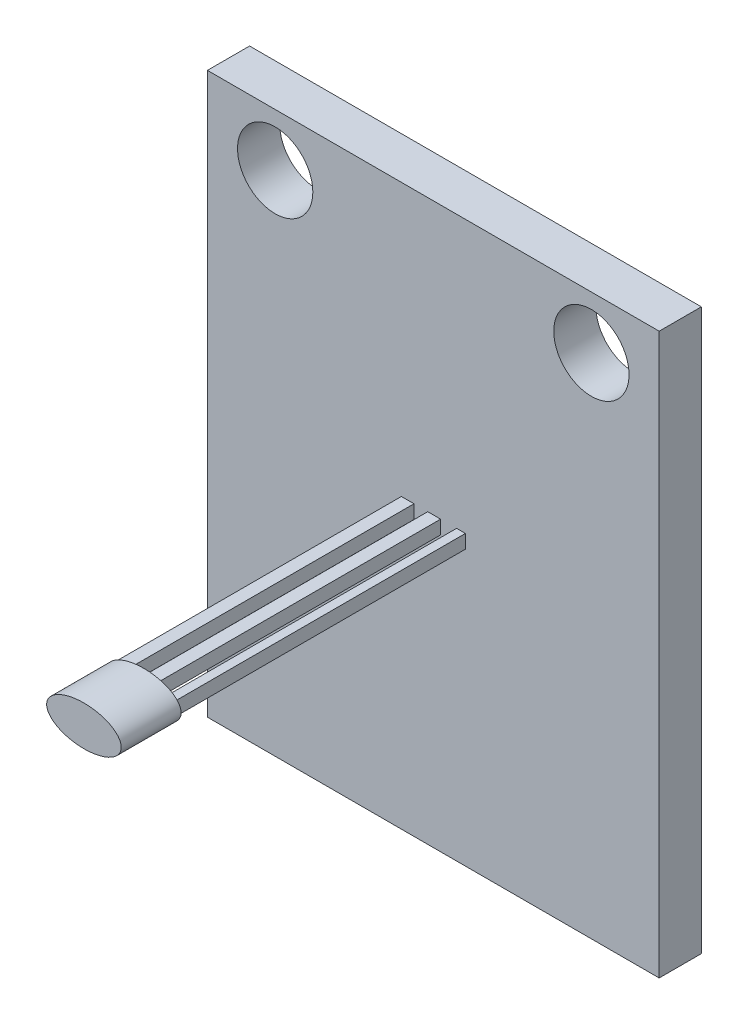
ISO-10303-21;
HEADER;
FILE_DESCRIPTION(('STEP AP214'),'2;1');
FILE_NAME('part.step','',(''),(''),'','','');
FILE_SCHEMA(('AUTOMOTIVE_DESIGN { 1 0 10303 214 1 1 1 1 }'));
ENDSEC;
DATA;
#1=APPLICATION_CONTEXT('core data for automotive mechanical design processes');
#2=APPLICATION_PROTOCOL_DEFINITION('international standard','automotive_design',2000,#1);
#3=PRODUCT_CONTEXT('',#1,'mechanical');
#4=PRODUCT('Part','Part','',(#3));
#5=PRODUCT_RELATED_PRODUCT_CATEGORY('part','',(#4));
#6=PRODUCT_DEFINITION_FORMATION('','',#4);
#7=PRODUCT_DEFINITION_CONTEXT('part definition',#1,'design');
#8=PRODUCT_DEFINITION('design','',#6,#7);
#9=PRODUCT_DEFINITION_SHAPE('','',#8);
#10=(LENGTH_UNIT() NAMED_UNIT(*) SI_UNIT(.MILLI.,.METRE.));
#11=(NAMED_UNIT(*) PLANE_ANGLE_UNIT() SI_UNIT($,.RADIAN.));
#12=(NAMED_UNIT(*) SI_UNIT($,.STERADIAN.) SOLID_ANGLE_UNIT());
#13=UNCERTAINTY_MEASURE_WITH_UNIT(LENGTH_MEASURE(1.E-05),#10,'distance_accuracy_value','');
#14=(GEOMETRIC_REPRESENTATION_CONTEXT(3) GLOBAL_UNCERTAINTY_ASSIGNED_CONTEXT((#13)) GLOBAL_UNIT_ASSIGNED_CONTEXT((#10,
#11,#12)) REPRESENTATION_CONTEXT('',''));
#15=CARTESIAN_POINT('',(0.,0.,0.));
#16=DIRECTION('',(0.,0.,1.));
#17=DIRECTION('',(1.,0.,0.));
#18=AXIS2_PLACEMENT_3D('',#15,#16,#17);
#19=CARTESIAN_POINT('',(0.,0.,1.4));
#20=DIRECTION('',(0.,0.,-1.));
#21=DIRECTION('',(-1.,0.,0.));
#22=AXIS2_PLACEMENT_3D('',#19,#20,#21);
#23=PLANE('',#22);
#24=DIRECTION('',(-1.,0.,0.));
#25=VECTOR('',#24,1.);
#26=CARTESIAN_POINT('',(25.6071890517305,9.56666547813627,1.4));
#27=LINE('',#26,#25);
#28=CARTESIAN_POINT('',(8.56621185978525,9.56666547813627,1.4));
#29=VERTEX_POINT('',#28);
#30=CARTESIAN_POINT('',(8.27322332473006,9.56666547813627,1.4));
#31=VERTEX_POINT('',#30);
#32=EDGE_CURVE('E527',#29,#31,#27,.T.);
#33=ORIENTED_EDGE('',*,*,#32,.F.);
#34=DIRECTION('',(0.,-1.,0.));
#35=VECTOR('',#34,1.);
#36=CARTESIAN_POINT('',(8.56621185978525,28.6251546395757,1.4));
#37=LINE('',#36,#35);
#38=CARTESIAN_POINT('',(8.56621185978525,9.11332010946358,1.4));
#39=VERTEX_POINT('',#38);
#40=EDGE_CURVE('E168',#29,#39,#37,.T.);
#41=ORIENTED_EDGE('',*,*,#40,.T.);
#42=DIRECTION('',(-1.,0.,0.));
#43=VECTOR('',#42,1.);
#44=CARTESIAN_POINT('',(25.6071890517305,9.11332010946358,1.4));
#45=LINE('',#44,#43);
#46=CARTESIAN_POINT('',(8.27322332473006,9.11332010946358,1.4));
#47=VERTEX_POINT('',#46);
#48=EDGE_CURVE('E152',#39,#47,#45,.T.);
#49=ORIENTED_EDGE('',*,*,#48,.T.);
#50=DIRECTION('',(0.,-1.,0.));
#51=VECTOR('',#50,1.);
#52=CARTESIAN_POINT('',(8.27322332473006,28.6251546395757,1.4));
#53=LINE('',#52,#51);
#54=EDGE_CURVE('E166',#31,#47,#53,.T.);
#55=ORIENTED_EDGE('',*,*,#54,.F.);
#56=EDGE_LOOP('',(#33,#41,#49,#55));
#57=FACE_BOUND('',#56,.T.);
#58=CARTESIAN_POINT('',(7.74318456730478,9.56666547813627,1.4));
#59=VERTEX_POINT('',#58);
#60=CARTESIAN_POINT('',(7.3156912028647,9.56666547813627,1.4));
#61=VERTEX_POINT('',#60);
#62=EDGE_CURVE('E59',#59,#61,#27,.T.);
#63=ORIENTED_EDGE('',*,*,#62,.F.);
#64=DIRECTION('',(0.,-1.,0.));
#65=VECTOR('',#64,1.);
#66=CARTESIAN_POINT('',(7.74318456730478,28.6251546395757,1.4));
#67=LINE('',#66,#65);
#68=CARTESIAN_POINT('',(7.74318456730478,9.11332010946358,1.4));
#69=VERTEX_POINT('',#68);
#70=EDGE_CURVE('E176',#59,#69,#67,.T.);
#71=ORIENTED_EDGE('',*,*,#70,.T.);
#72=CARTESIAN_POINT('',(7.3156912028647,9.11332010946358,1.4));
#73=VERTEX_POINT('',#72);
#74=EDGE_CURVE('E51',#69,#73,#45,.T.);
#75=ORIENTED_EDGE('',*,*,#74,.T.);
#76=DIRECTION('',(0.,-1.,0.));
#77=VECTOR('',#76,1.);
#78=CARTESIAN_POINT('',(7.31569120286469,28.6251546395757,1.4));
#79=LINE('',#78,#77);
#80=EDGE_CURVE('E201',#61,#73,#79,.T.);
#81=ORIENTED_EDGE('',*,*,#80,.F.);
#82=EDGE_LOOP('',(#63,#71,#75,#81));
#83=FACE_BOUND('',#82,.T.);
#84=CARTESIAN_POINT('',(6.85905056357641,9.56666547813627,1.4));
#85=VERTEX_POINT('',#84);
#86=CARTESIAN_POINT('',(6.44078895237855,9.56666547813627,1.4));
#87=VERTEX_POINT('',#86);
#88=EDGE_CURVE('E169',#85,#87,#27,.T.);
#89=ORIENTED_EDGE('',*,*,#88,.F.);
#90=DIRECTION('',(0.,-1.,0.));
#91=VECTOR('',#90,1.);
#92=CARTESIAN_POINT('',(6.8590505635764,28.6251546395757,1.4));
#93=LINE('',#92,#91);
#94=CARTESIAN_POINT('',(6.85905056357641,9.11332010946358,1.4));
#95=VERTEX_POINT('',#94);
#96=EDGE_CURVE('E204',#85,#95,#93,.T.);
#97=ORIENTED_EDGE('',*,*,#96,.T.);
#98=CARTESIAN_POINT('',(6.44078895237855,9.11332010946358,1.4));
#99=VERTEX_POINT('',#98);
#100=EDGE_CURVE('E171',#95,#99,#45,.T.);
#101=ORIENTED_EDGE('',*,*,#100,.T.);
#102=DIRECTION('',(0.,-1.,0.));
#103=VECTOR('',#102,1.);
#104=CARTESIAN_POINT('',(6.44078895237854,28.6251546395757,1.4));
#105=LINE('',#104,#103);
#106=EDGE_CURVE('E180',#87,#99,#105,.T.);
#107=ORIENTED_EDGE('',*,*,#106,.F.);
#108=EDGE_LOOP('',(#89,#97,#101,#107));
#109=FACE_BOUND('',#108,.T.);
#110=CARTESIAN_POINT('',(12.75,16.85,1.4));
#111=DIRECTION('',(0.,0.,1.));
#112=DIRECTION('',(-1.,0.,0.));
#113=AXIS2_PLACEMENT_3D('',#110,#111,#112);
#114=CIRCLE('',#113,1.25);
#115=CARTESIAN_POINT('',(11.5,16.85,1.4));
#116=VERTEX_POINT('',#115);
#117=EDGE_CURVE('E211',#116,#116,#114,.T.);
#118=ORIENTED_EDGE('',*,*,#117,.F.);
#119=EDGE_LOOP('',(#118));
#120=FACE_BOUND('',#119,.T.);
#121=DIRECTION('',(0.,-1.,0.));
#122=VECTOR('',#121,1.);
#123=CARTESIAN_POINT('',(0.,0.,1.4));
#124=LINE('',#123,#122);
#125=CARTESIAN_POINT('',(0.,18.6,1.4));
#126=VERTEX_POINT('',#125);
#127=CARTESIAN_POINT('',(0.,0.,1.4));
#128=VERTEX_POINT('',#127);
#129=EDGE_CURVE('E273',#126,#128,#124,.T.);
#130=ORIENTED_EDGE('',*,*,#129,.T.);
#131=DIRECTION('',(1.,0.,0.));
#132=VECTOR('',#131,1.);
#133=CARTESIAN_POINT('',(0.,0.,1.4));
#134=LINE('',#133,#132);
#135=CARTESIAN_POINT('',(15.,0.,1.4));
#136=VERTEX_POINT('',#135);
#137=EDGE_CURVE('E286',#128,#136,#134,.T.);
#138=ORIENTED_EDGE('',*,*,#137,.T.);
#139=DIRECTION('',(0.,1.,0.));
#140=VECTOR('',#139,1.);
#141=CARTESIAN_POINT('',(15.,0.,1.4));
#142=LINE('',#141,#140);
#143=CARTESIAN_POINT('',(15.,18.6,1.4));
#144=VERTEX_POINT('',#143);
#145=EDGE_CURVE('E266',#136,#144,#142,.T.);
#146=ORIENTED_EDGE('',*,*,#145,.T.);
#147=DIRECTION('',(-1.,0.,0.));
#148=VECTOR('',#147,1.);
#149=CARTESIAN_POINT('',(0.,18.6,1.4));
#150=LINE('',#149,#148);
#151=EDGE_CURVE('E280',#144,#126,#150,.T.);
#152=ORIENTED_EDGE('',*,*,#151,.T.);
#153=EDGE_LOOP('',(#130,#138,#146,#152));
#154=FACE_BOUND('',#153,.T.);
#155=CARTESIAN_POINT('',(2.25,16.85,1.4));
#156=DIRECTION('',(0.,0.,1.));
#157=DIRECTION('',(1.,0.,0.));
#158=AXIS2_PLACEMENT_3D('',#155,#156,#157);
#159=CIRCLE('',#158,1.25);
#160=CARTESIAN_POINT('',(3.5,16.85,1.4));
#161=VERTEX_POINT('',#160);
#162=EDGE_CURVE('E289',#161,#161,#159,.T.);
#163=ORIENTED_EDGE('',*,*,#162,.F.);
#164=EDGE_LOOP('',(#163));
#165=FACE_BOUND('',#164,.T.);
#166=ADVANCED_FACE('F36',(#57,#83,#109,#120,#154,#165),#23,.F.);
#167=CARTESIAN_POINT('',(0.,0.,0.));
#168=DIRECTION('',(0.,0.,-1.));
#169=DIRECTION('',(-1.,0.,0.));
#170=AXIS2_PLACEMENT_3D('',#167,#168,#169);
#171=PLANE('',#170);
#172=CARTESIAN_POINT('',(2.25,16.85,0.));
#173=DIRECTION('',(0.,0.,1.));
#174=DIRECTION('',(1.,0.,0.));
#175=AXIS2_PLACEMENT_3D('',#172,#173,#174);
#176=CIRCLE('',#175,1.25);
#177=CARTESIAN_POINT('',(3.5,16.85,0.));
#178=VERTEX_POINT('',#177);
#179=EDGE_CURVE('E291',#178,#178,#176,.T.);
#180=ORIENTED_EDGE('',*,*,#179,.T.);
#181=EDGE_LOOP('',(#180));
#182=FACE_BOUND('',#181,.T.);
#183=DIRECTION('',(0.,-1.,0.));
#184=VECTOR('',#183,1.);
#185=CARTESIAN_POINT('',(0.,0.,0.));
#186=LINE('',#185,#184);
#187=CARTESIAN_POINT('',(0.,18.6,0.));
#188=VERTEX_POINT('',#187);
#189=CARTESIAN_POINT('',(0.,0.,0.));
#190=VERTEX_POINT('',#189);
#191=EDGE_CURVE('E262',#188,#190,#186,.T.);
#192=ORIENTED_EDGE('',*,*,#191,.F.);
#193=DIRECTION('',(-1.,0.,0.));
#194=VECTOR('',#193,1.);
#195=CARTESIAN_POINT('',(0.,18.6,0.));
#196=LINE('',#195,#194);
#197=CARTESIAN_POINT('',(15.,18.6,0.));
#198=VERTEX_POINT('',#197);
#199=EDGE_CURVE('E271',#198,#188,#196,.T.);
#200=ORIENTED_EDGE('',*,*,#199,.F.);
#201=DIRECTION('',(0.,1.,0.));
#202=VECTOR('',#201,1.);
#203=CARTESIAN_POINT('',(15.,0.,0.));
#204=LINE('',#203,#202);
#205=CARTESIAN_POINT('',(15.,0.,0.));
#206=VERTEX_POINT('',#205);
#207=EDGE_CURVE('E261',#206,#198,#204,.T.);
#208=ORIENTED_EDGE('',*,*,#207,.F.);
#209=DIRECTION('',(1.,0.,0.));
#210=VECTOR('',#209,1.);
#211=CARTESIAN_POINT('',(0.,0.,0.));
#212=LINE('',#211,#210);
#213=EDGE_CURVE('E251',#190,#206,#212,.T.);
#214=ORIENTED_EDGE('',*,*,#213,.F.);
#215=EDGE_LOOP('',(#192,#200,#208,#214));
#216=FACE_BOUND('',#215,.T.);
#217=CARTESIAN_POINT('',(12.75,16.85,0.));
#218=DIRECTION('',(0.,0.,1.));
#219=DIRECTION('',(-1.,0.,0.));
#220=AXIS2_PLACEMENT_3D('',#217,#218,#219);
#221=CIRCLE('',#220,1.25);
#222=CARTESIAN_POINT('',(11.5,16.85,0.));
#223=VERTEX_POINT('',#222);
#224=EDGE_CURVE('E210',#223,#223,#221,.T.);
#225=ORIENTED_EDGE('',*,*,#224,.T.);
#226=EDGE_LOOP('',(#225));
#227=FACE_BOUND('',#226,.T.);
#228=ADVANCED_FACE('F232',(#182,#216,#227),#171,.T.);
#229=CARTESIAN_POINT('',(0.,0.,1.4));
#230=DIRECTION('',(1.,0.,0.));
#231=DIRECTION('',(0.,0.,-1.));
#232=AXIS2_PLACEMENT_3D('',#229,#230,#231);
#233=PLANE('',#232);
#234=ORIENTED_EDGE('',*,*,#191,.T.);
#235=DIRECTION('',(0.,0.,-1.));
#236=VECTOR('',#235,1.);
#237=CARTESIAN_POINT('',(0.,0.,1.4));
#238=LINE('',#237,#236);
#239=EDGE_CURVE('E44',#128,#190,#238,.T.);
#240=ORIENTED_EDGE('',*,*,#239,.F.);
#241=ORIENTED_EDGE('',*,*,#129,.F.);
#242=DIRECTION('',(0.,0.,-1.));
#243=VECTOR('',#242,1.);
#244=CARTESIAN_POINT('',(0.,18.6,1.4));
#245=LINE('',#244,#243);
#246=EDGE_CURVE('E277',#126,#188,#245,.T.);
#247=ORIENTED_EDGE('',*,*,#246,.T.);
#248=EDGE_LOOP('',(#234,#240,#241,#247));
#249=FACE_BOUND('',#248,.T.);
#250=ADVANCED_FACE('F38',(#249),#233,.F.);
#251=CARTESIAN_POINT('',(0.,0.,1.4));
#252=DIRECTION('',(0.,1.,0.));
#253=DIRECTION('',(-1.,0.,0.));
#254=AXIS2_PLACEMENT_3D('',#251,#252,#253);
#255=PLANE('',#254);
#256=ORIENTED_EDGE('',*,*,#213,.T.);
#257=DIRECTION('',(0.,0.,-1.));
#258=VECTOR('',#257,1.);
#259=CARTESIAN_POINT('',(15.,0.,1.4));
#260=LINE('',#259,#258);
#261=EDGE_CURVE('E254',#136,#206,#260,.T.);
#262=ORIENTED_EDGE('',*,*,#261,.F.);
#263=ORIENTED_EDGE('',*,*,#137,.F.);
#264=ORIENTED_EDGE('',*,*,#239,.T.);
#265=EDGE_LOOP('',(#256,#262,#263,#264));
#266=FACE_BOUND('',#265,.T.);
#267=ADVANCED_FACE('F241',(#266),#255,.F.);
#268=CARTESIAN_POINT('',(15.,0.,1.4));
#269=DIRECTION('',(-1.,0.,0.));
#270=DIRECTION('',(0.,-1.,0.));
#271=AXIS2_PLACEMENT_3D('',#268,#269,#270);
#272=PLANE('',#271);
#273=ORIENTED_EDGE('',*,*,#207,.T.);
#274=DIRECTION('',(0.,0.,-1.));
#275=VECTOR('',#274,1.);
#276=CARTESIAN_POINT('',(15.,18.6,1.4));
#277=LINE('',#276,#275);
#278=EDGE_CURVE('E267',#144,#198,#277,.T.);
#279=ORIENTED_EDGE('',*,*,#278,.F.);
#280=ORIENTED_EDGE('',*,*,#145,.F.);
#281=ORIENTED_EDGE('',*,*,#261,.T.);
#282=EDGE_LOOP('',(#273,#279,#280,#281));
#283=FACE_BOUND('',#282,.T.);
#284=ADVANCED_FACE('F238',(#283),#272,.F.);
#285=CARTESIAN_POINT('',(0.,18.6,1.4));
#286=DIRECTION('',(0.,-1.,0.));
#287=DIRECTION('',(0.,0.,-1.));
#288=AXIS2_PLACEMENT_3D('',#285,#286,#287);
#289=PLANE('',#288);
#290=ORIENTED_EDGE('',*,*,#199,.T.);
#291=ORIENTED_EDGE('',*,*,#246,.F.);
#292=ORIENTED_EDGE('',*,*,#151,.F.);
#293=ORIENTED_EDGE('',*,*,#278,.T.);
#294=EDGE_LOOP('',(#290,#291,#292,#293));
#295=FACE_BOUND('',#294,.T.);
#296=ADVANCED_FACE('F228',(#295),#289,.F.);
#297=CARTESIAN_POINT('',(2.25,16.85,1.4));
#298=DIRECTION('',(0.,0.,-1.));
#299=DIRECTION('',(-1.,0.,0.));
#300=AXIS2_PLACEMENT_3D('',#297,#298,#299);
#301=CYLINDRICAL_SURFACE('',#300,1.25);
#302=ORIENTED_EDGE('',*,*,#162,.T.);
#303=EDGE_LOOP('',(#302));
#304=FACE_BOUND('',#303,.T.);
#305=ORIENTED_EDGE('',*,*,#179,.F.);
#306=EDGE_LOOP('',(#305));
#307=FACE_BOUND('',#306,.T.);
#308=ADVANCED_FACE('F224',(#304,#307),#301,.F.);
#309=CARTESIAN_POINT('',(12.75,16.85,1.4));
#310=DIRECTION('',(0.,0.,-1.));
#311=DIRECTION('',(-1.,0.,0.));
#312=AXIS2_PLACEMENT_3D('',#309,#310,#311);
#313=CYLINDRICAL_SURFACE('',#312,1.25);
#314=ORIENTED_EDGE('',*,*,#117,.T.);
#315=EDGE_LOOP('',(#314));
#316=FACE_BOUND('',#315,.T.);
#317=ORIENTED_EDGE('',*,*,#224,.F.);
#318=EDGE_LOOP('',(#317));
#319=FACE_BOUND('',#318,.T.);
#320=ADVANCED_FACE('F219',(#316,#319),#313,.F.);
#321=CARTESIAN_POINT('',(7.5,9.3,13.));
#322=DIRECTION('',(0.,0.,1.));
#323=DIRECTION('',(-1.,0.,0.));
#324=AXIS2_PLACEMENT_3D('',#321,#322,#323);
#325=ELLIPSE('',#324,1.23800701552932,0.65851436996241);
#326=DIRECTION('',(0.,0.,-1.));
#327=VECTOR('',#326,1.);
#328=SURFACE_OF_LINEAR_EXTRUSION('',#325,#327);
#329=CARTESIAN_POINT('',(7.5,9.3,11.0104693942587));
#330=DIRECTION('',(0.,0.,1.));
#331=DIRECTION('',(-1.,0.,0.));
#332=AXIS2_PLACEMENT_3D('',#329,#330,#331);
#333=ELLIPSE('',#332,1.23800701552932,0.65851436996241);
#334=CARTESIAN_POINT('',(6.26199298447068,9.3,11.0104693942587));
#335=VERTEX_POINT('',#334);
#336=EDGE_CURVE('E11',#335,#335,#333,.T.);
#337=ORIENTED_EDGE('',*,*,#336,.T.);
#338=EDGE_LOOP('',(#337));
#339=FACE_BOUND('',#338,.T.);
#340=CARTESIAN_POINT('',(6.26199298447068,9.3,13.));
#341=VERTEX_POINT('',#340);
#342=EDGE_CURVE('E197',#341,#341,#325,.T.);
#343=ORIENTED_EDGE('',*,*,#342,.F.);
#344=EDGE_LOOP('',(#343));
#345=FACE_BOUND('',#344,.T.);
#346=ADVANCED_FACE('F214',(#339,#345),#328,.F.);
#347=CARTESIAN_POINT('',(7.5,9.3,13.));
#348=DIRECTION('',(0.,0.,1.));
#349=DIRECTION('',(1.,0.,0.));
#350=AXIS2_PLACEMENT_3D('',#347,#348,#349);
#351=PLANE('',#350);
#352=ORIENTED_EDGE('',*,*,#342,.T.);
#353=EDGE_LOOP('',(#352));
#354=FACE_BOUND('',#353,.T.);
#355=ADVANCED_FACE('F218',(#354),#351,.T.);
#356=CARTESIAN_POINT('',(6.8590505635764,28.6251546395757,11.0104693942587));
#357=DIRECTION('',(-1.,0.,0.));
#358=DIRECTION('',(0.,-1.,0.));
#359=AXIS2_PLACEMENT_3D('',#356,#357,#358);
#360=PLANE('',#359);
#361=ORIENTED_EDGE('',*,*,#96,.F.);
#362=DIRECTION('',(0.,0.,1.));
#363=VECTOR('',#362,1.);
#364=CARTESIAN_POINT('',(6.8590505635764,9.56666547813627,11.0104693942587));
#365=LINE('',#364,#363);
#366=CARTESIAN_POINT('',(6.85905056357641,9.56666547813627,11.0104693942587));
#367=VERTEX_POINT('',#366);
#368=EDGE_CURVE('E193',#85,#367,#365,.T.);
#369=ORIENTED_EDGE('',*,*,#368,.T.);
#370=DIRECTION('',(0.,-1.,0.));
#371=VECTOR('',#370,1.);
#372=CARTESIAN_POINT('',(6.8590505635764,28.6251546395757,11.0104693942587));
#373=LINE('',#372,#371);
#374=CARTESIAN_POINT('',(6.85905056357641,9.11332010946358,11.0104693942587));
#375=VERTEX_POINT('',#374);
#376=EDGE_CURVE('E194',#367,#375,#373,.T.);
#377=ORIENTED_EDGE('',*,*,#376,.T.);
#378=DIRECTION('',(0.,0.,-1.));
#379=VECTOR('',#378,1.);
#380=CARTESIAN_POINT('',(6.8590505635764,9.11332010946358,11.0104693942587));
#381=LINE('',#380,#379);
#382=EDGE_CURVE('E513',#375,#95,#381,.T.);
#383=ORIENTED_EDGE('',*,*,#382,.T.);
#384=EDGE_LOOP('',(#361,#369,#377,#383));
#385=FACE_BOUND('',#384,.T.);
#386=ADVANCED_FACE('F341',(#385),#360,.F.);
#387=CARTESIAN_POINT('',(7.31569120286469,28.6251546395757,11.0104693942587));
#388=DIRECTION('',(1.,0.,0.));
#389=DIRECTION('',(0.,1.,0.));
#390=AXIS2_PLACEMENT_3D('',#387,#388,#389);
#391=PLANE('',#390);
#392=DIRECTION('',(0.,-1.,0.));
#393=VECTOR('',#392,1.);
#394=CARTESIAN_POINT('',(7.31569120286469,28.6251546395757,11.0104693942587));
#395=LINE('',#394,#393);
#396=CARTESIAN_POINT('',(7.3156912028647,9.56666547813627,11.0104693942587));
#397=VERTEX_POINT('',#396);
#398=CARTESIAN_POINT('',(7.3156912028647,9.11332010946358,11.0104693942587));
#399=VERTEX_POINT('',#398);
#400=EDGE_CURVE('E198',#397,#399,#395,.T.);
#401=ORIENTED_EDGE('',*,*,#400,.F.);
#402=DIRECTION('',(0.,0.,-1.));
#403=VECTOR('',#402,1.);
#404=CARTESIAN_POINT('',(7.31569120286469,9.56666547813627,11.0104693942587));
#405=LINE('',#404,#403);
#406=EDGE_CURVE('E490',#397,#61,#405,.T.);
#407=ORIENTED_EDGE('',*,*,#406,.T.);
#408=ORIENTED_EDGE('',*,*,#80,.T.);
#409=DIRECTION('',(0.,0.,1.));
#410=VECTOR('',#409,1.);
#411=CARTESIAN_POINT('',(7.31569120286469,9.11332010946358,11.0104693942587));
#412=LINE('',#411,#410);
#413=EDGE_CURVE('E516',#73,#399,#412,.T.);
#414=ORIENTED_EDGE('',*,*,#413,.T.);
#415=EDGE_LOOP('',(#401,#407,#408,#414));
#416=FACE_BOUND('',#415,.T.);
#417=ADVANCED_FACE('F368',(#416),#391,.F.);
#418=CARTESIAN_POINT('',(7.74318456730478,28.6251546395757,11.0104693942587));
#419=DIRECTION('',(-1.,0.,0.));
#420=DIRECTION('',(0.,-1.,0.));
#421=AXIS2_PLACEMENT_3D('',#418,#419,#420);
#422=PLANE('',#421);
#423=ORIENTED_EDGE('',*,*,#70,.F.);
#424=DIRECTION('',(0.,0.,1.));
#425=VECTOR('',#424,1.);
#426=CARTESIAN_POINT('',(7.74318456730478,9.56666547813627,11.0104693942587));
#427=LINE('',#426,#425);
#428=CARTESIAN_POINT('',(7.74318456730479,9.56666547813627,11.0104693942587));
#429=VERTEX_POINT('',#428);
#430=EDGE_CURVE('E487',#59,#429,#427,.T.);
#431=ORIENTED_EDGE('',*,*,#430,.T.);
#432=DIRECTION('',(0.,-1.,0.));
#433=VECTOR('',#432,1.);
#434=CARTESIAN_POINT('',(7.74318456730478,28.6251546395757,11.0104693942587));
#435=LINE('',#434,#433);
#436=CARTESIAN_POINT('',(7.74318456730479,9.11332010946358,11.0104693942587));
#437=VERTEX_POINT('',#436);
#438=EDGE_CURVE('E178',#429,#437,#435,.T.);
#439=ORIENTED_EDGE('',*,*,#438,.T.);
#440=DIRECTION('',(0.,0.,-1.));
#441=VECTOR('',#440,1.);
#442=CARTESIAN_POINT('',(7.74318456730478,9.11332010946358,11.0104693942587));
#443=LINE('',#442,#441);
#444=EDGE_CURVE('E160',#437,#69,#443,.T.);
#445=ORIENTED_EDGE('',*,*,#444,.T.);
#446=EDGE_LOOP('',(#423,#431,#439,#445));
#447=FACE_BOUND('',#446,.T.);
#448=ADVANCED_FACE('F378',(#447),#422,.F.);
#449=CARTESIAN_POINT('',(8.27322332473006,28.6251546395757,11.0104693942587));
#450=DIRECTION('',(1.,0.,0.));
#451=DIRECTION('',(0.,1.,0.));
#452=AXIS2_PLACEMENT_3D('',#449,#450,#451);
#453=PLANE('',#452);
#454=DIRECTION('',(0.,-1.,0.));
#455=VECTOR('',#454,1.);
#456=CARTESIAN_POINT('',(8.27322332473006,28.6251546395757,11.0104693942587));
#457=LINE('',#456,#455);
#458=CARTESIAN_POINT('',(8.27322332473006,9.56666547813627,11.0104693942587));
#459=VERTEX_POINT('',#458);
#460=CARTESIAN_POINT('',(8.27322332473006,9.11332010946358,11.0104693942587));
#461=VERTEX_POINT('',#460);
#462=EDGE_CURVE('E175',#459,#461,#457,.T.);
#463=ORIENTED_EDGE('',*,*,#462,.F.);
#464=DIRECTION('',(0.,0.,-1.));
#465=VECTOR('',#464,1.);
#466=CARTESIAN_POINT('',(8.27322332473006,9.56666547813627,11.0104693942587));
#467=LINE('',#466,#465);
#468=EDGE_CURVE('E174',#459,#31,#467,.T.);
#469=ORIENTED_EDGE('',*,*,#468,.T.);
#470=ORIENTED_EDGE('',*,*,#54,.T.);
#471=DIRECTION('',(0.,0.,1.));
#472=VECTOR('',#471,1.);
#473=CARTESIAN_POINT('',(8.27322332473006,9.11332010946358,11.0104693942587));
#474=LINE('',#473,#472);
#475=EDGE_CURVE('E149',#47,#461,#474,.T.);
#476=ORIENTED_EDGE('',*,*,#475,.T.);
#477=EDGE_LOOP('',(#463,#469,#470,#476));
#478=FACE_BOUND('',#477,.T.);
#479=ADVANCED_FACE('F173',(#478),#453,.F.);
#480=CARTESIAN_POINT('',(6.44078895237854,28.6251546395757,11.0104693942587));
#481=DIRECTION('',(1.,0.,0.));
#482=DIRECTION('',(0.,1.,0.));
#483=AXIS2_PLACEMENT_3D('',#480,#481,#482);
#484=PLANE('',#483);
#485=DIRECTION('',(0.,-1.,0.));
#486=VECTOR('',#485,1.);
#487=CARTESIAN_POINT('',(6.44078895237854,28.6251546395757,11.0104693942587));
#488=LINE('',#487,#486);
#489=CARTESIAN_POINT('',(6.44078895237855,9.56666547813627,11.0104693942587));
#490=VERTEX_POINT('',#489);
#491=CARTESIAN_POINT('',(6.44078895237854,9.11332010946358,11.0104693942587));
#492=VERTEX_POINT('',#491);
#493=EDGE_CURVE('E186',#490,#492,#488,.T.);
#494=ORIENTED_EDGE('',*,*,#493,.F.);
#495=DIRECTION('',(0.,0.,-1.));
#496=VECTOR('',#495,1.);
#497=CARTESIAN_POINT('',(6.44078895237854,9.56666547813627,11.0104693942587));
#498=LINE('',#497,#496);
#499=EDGE_CURVE('E507',#490,#87,#498,.T.);
#500=ORIENTED_EDGE('',*,*,#499,.T.);
#501=ORIENTED_EDGE('',*,*,#106,.T.);
#502=DIRECTION('',(0.,0.,1.));
#503=VECTOR('',#502,1.);
#504=CARTESIAN_POINT('',(6.44078895237854,9.11332010946358,11.0104693942587));
#505=LINE('',#504,#503);
#506=EDGE_CURVE('E161',#99,#492,#505,.T.);
#507=ORIENTED_EDGE('',*,*,#506,.T.);
#508=EDGE_LOOP('',(#494,#500,#501,#507));
#509=FACE_BOUND('',#508,.T.);
#510=ADVANCED_FACE('F397',(#509),#484,.F.);
#511=CARTESIAN_POINT('',(8.56621185978525,28.6251546395757,11.0104693942587));
#512=DIRECTION('',(-1.,0.,0.));
#513=DIRECTION('',(0.,-1.,0.));
#514=AXIS2_PLACEMENT_3D('',#511,#512,#513);
#515=PLANE('',#514);
#516=ORIENTED_EDGE('',*,*,#40,.F.);
#517=DIRECTION('',(0.,0.,1.));
#518=VECTOR('',#517,1.);
#519=CARTESIAN_POINT('',(8.56621185978525,9.56666547813627,11.0104693942587));
#520=LINE('',#519,#518);
#521=CARTESIAN_POINT('',(8.56621185978526,9.56666547813627,11.0104693942587));
#522=VERTEX_POINT('',#521);
#523=EDGE_CURVE('E510',#29,#522,#520,.T.);
#524=ORIENTED_EDGE('',*,*,#523,.T.);
#525=DIRECTION('',(0.,-1.,0.));
#526=VECTOR('',#525,1.);
#527=CARTESIAN_POINT('',(8.56621185978525,28.6251546395757,11.0104693942587));
#528=LINE('',#527,#526);
#529=CARTESIAN_POINT('',(8.56621185978526,9.11332010946358,11.0104693942587));
#530=VERTEX_POINT('',#529);
#531=EDGE_CURVE('E189',#522,#530,#528,.T.);
#532=ORIENTED_EDGE('',*,*,#531,.T.);
#533=DIRECTION('',(0.,0.,-1.));
#534=VECTOR('',#533,1.);
#535=CARTESIAN_POINT('',(8.56621185978525,9.11332010946358,11.0104693942587));
#536=LINE('',#535,#534);
#537=EDGE_CURVE('E522',#530,#39,#536,.T.);
#538=ORIENTED_EDGE('',*,*,#537,.T.);
#539=EDGE_LOOP('',(#516,#524,#532,#538));
#540=FACE_BOUND('',#539,.T.);
#541=ADVANCED_FACE('F406',(#540),#515,.F.);
#542=CARTESIAN_POINT('',(8.56621185978525,28.6251546395757,11.0104693942587));
#543=DIRECTION('',(0.,0.,1.));
#544=DIRECTION('',(1.,0.,0.));
#545=AXIS2_PLACEMENT_3D('',#542,#543,#544);
#546=PLANE('',#545);
#547=ORIENTED_EDGE('',*,*,#376,.F.);
#548=DIRECTION('',(-1.,0.,0.));
#549=VECTOR('',#548,1.);
#550=CARTESIAN_POINT('',(25.6071890517305,9.56666547813627,11.0104693942587));
#551=LINE('',#550,#549);
#552=EDGE_CURVE('E495',#367,#490,#551,.T.);
#553=ORIENTED_EDGE('',*,*,#552,.T.);
#554=ORIENTED_EDGE('',*,*,#493,.T.);
#555=DIRECTION('',(-1.,0.,0.));
#556=VECTOR('',#555,1.);
#557=CARTESIAN_POINT('',(25.6071890517305,9.11332010946358,11.0104693942587));
#558=LINE('',#557,#556);
#559=EDGE_CURVE('E524',#375,#492,#558,.T.);
#560=ORIENTED_EDGE('',*,*,#559,.F.);
#561=EDGE_LOOP('',(#547,#553,#554,#560));
#562=FACE_BOUND('',#561,.T.);
#563=EDGE_CURVE('E485',#429,#397,#551,.T.);
#564=ORIENTED_EDGE('',*,*,#563,.T.);
#565=ORIENTED_EDGE('',*,*,#400,.T.);
#566=EDGE_CURVE('E501',#437,#399,#558,.T.);
#567=ORIENTED_EDGE('',*,*,#566,.F.);
#568=ORIENTED_EDGE('',*,*,#438,.F.);
#569=EDGE_LOOP('',(#564,#565,#567,#568));
#570=FACE_BOUND('',#569,.T.);
#571=EDGE_CURVE('E494',#522,#459,#551,.T.);
#572=ORIENTED_EDGE('',*,*,#571,.T.);
#573=ORIENTED_EDGE('',*,*,#462,.T.);
#574=EDGE_CURVE('E155',#530,#461,#558,.T.);
#575=ORIENTED_EDGE('',*,*,#574,.F.);
#576=ORIENTED_EDGE('',*,*,#531,.F.);
#577=EDGE_LOOP('',(#572,#573,#575,#576));
#578=FACE_BOUND('',#577,.T.);
#579=ORIENTED_EDGE('',*,*,#336,.F.);
#580=EDGE_LOOP('',(#579));
#581=FACE_BOUND('',#580,.T.);
#582=ADVANCED_FACE('F416',(#562,#570,#578,#581),#546,.F.);
#583=CARTESIAN_POINT('',(25.6071890517305,9.11332010946358,11.0104693942587));
#584=DIRECTION('',(0.,1.,0.));
#585=DIRECTION('',(0.,0.,1.));
#586=AXIS2_PLACEMENT_3D('',#583,#584,#585);
#587=PLANE('',#586);
#588=ORIENTED_EDGE('',*,*,#48,.F.);
#589=ORIENTED_EDGE('',*,*,#537,.F.);
#590=ORIENTED_EDGE('',*,*,#574,.T.);
#591=ORIENTED_EDGE('',*,*,#475,.F.);
#592=EDGE_LOOP('',(#588,#589,#590,#591));
#593=FACE_BOUND('',#592,.T.);
#594=ADVANCED_FACE('F151',(#593),#587,.F.);
#595=CARTESIAN_POINT('',(25.6071890517305,9.56666547813627,11.0104693942587));
#596=DIRECTION('',(0.,-1.,0.));
#597=DIRECTION('',(0.,0.,-1.));
#598=AXIS2_PLACEMENT_3D('',#595,#596,#597);
#599=PLANE('',#598);
#600=ORIENTED_EDGE('',*,*,#571,.F.);
#601=ORIENTED_EDGE('',*,*,#523,.F.);
#602=ORIENTED_EDGE('',*,*,#32,.T.);
#603=ORIENTED_EDGE('',*,*,#468,.F.);
#604=EDGE_LOOP('',(#600,#601,#602,#603));
#605=FACE_BOUND('',#604,.T.);
#606=ADVANCED_FACE('F436',(#605),#599,.F.);
#607=ORIENTED_EDGE('',*,*,#559,.T.);
#608=ORIENTED_EDGE('',*,*,#506,.F.);
#609=ORIENTED_EDGE('',*,*,#100,.F.);
#610=ORIENTED_EDGE('',*,*,#382,.F.);
#611=EDGE_LOOP('',(#607,#608,#609,#610));
#612=FACE_BOUND('',#611,.T.);
#613=ADVANCED_FACE('F438',(#612),#587,.F.);
#614=ORIENTED_EDGE('',*,*,#88,.T.);
#615=ORIENTED_EDGE('',*,*,#499,.F.);
#616=ORIENTED_EDGE('',*,*,#552,.F.);
#617=ORIENTED_EDGE('',*,*,#368,.F.);
#618=EDGE_LOOP('',(#614,#615,#616,#617));
#619=FACE_BOUND('',#618,.T.);
#620=ADVANCED_FACE('F449',(#619),#599,.F.);
#621=ORIENTED_EDGE('',*,*,#74,.F.);
#622=ORIENTED_EDGE('',*,*,#444,.F.);
#623=ORIENTED_EDGE('',*,*,#566,.T.);
#624=ORIENTED_EDGE('',*,*,#413,.F.);
#625=EDGE_LOOP('',(#621,#622,#623,#624));
#626=FACE_BOUND('',#625,.T.);
#627=ADVANCED_FACE('F439',(#626),#587,.F.);
#628=ORIENTED_EDGE('',*,*,#563,.F.);
#629=ORIENTED_EDGE('',*,*,#430,.F.);
#630=ORIENTED_EDGE('',*,*,#62,.T.);
#631=ORIENTED_EDGE('',*,*,#406,.F.);
#632=EDGE_LOOP('',(#628,#629,#630,#631));
#633=FACE_BOUND('',#632,.T.);
#634=ADVANCED_FACE('F450',(#633),#599,.F.);
#635=CLOSED_SHELL('',(#166,#228,#250,#267,#284,#296,#308,#320,#346,#355,#386,#417,#448,#479,
#510,#541,#582,#594,#606,#613,#620,#627,#634));
#636=MANIFOLD_SOLID_BREP('B2',#635);
#637=ADVANCED_BREP_SHAPE_REPRESENTATION('',(#18,#636),#14);
#638=SHAPE_DEFINITION_REPRESENTATION(#9,#637);
ENDSEC;
END-ISO-10303-21;
